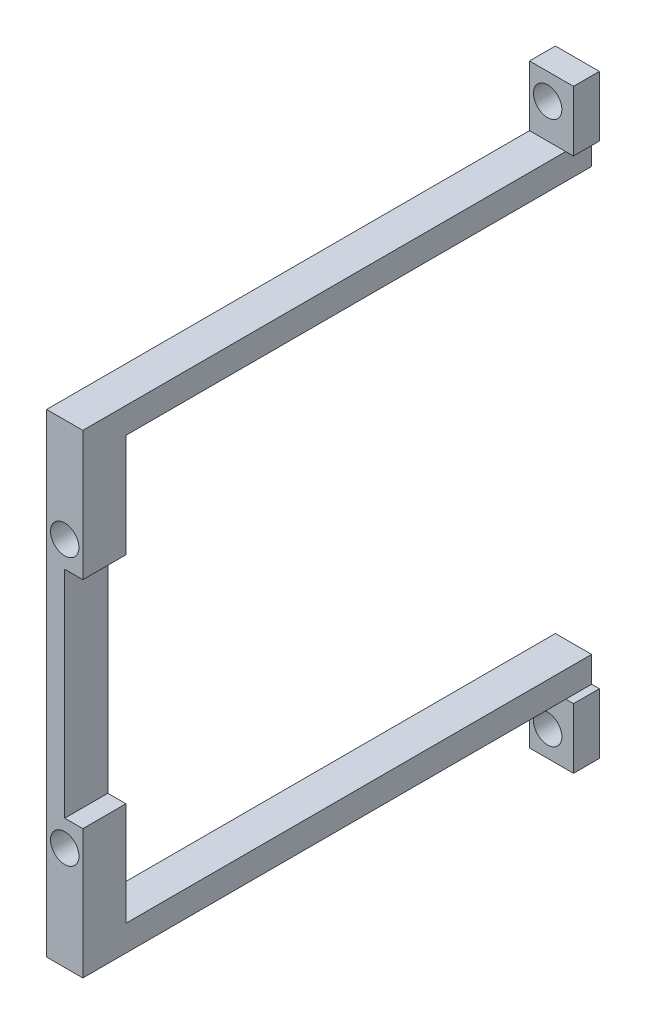
ISO-10303-21;
HEADER;
FILE_DESCRIPTION(('STEP AP214'),'2;1');
FILE_NAME('part.step','',(''),(''),'','','');
FILE_SCHEMA(('AUTOMOTIVE_DESIGN { 1 0 10303 214 1 1 1 1 }'));
ENDSEC;
DATA;
#1=APPLICATION_CONTEXT('core data for automotive mechanical design processes');
#2=APPLICATION_PROTOCOL_DEFINITION('international standard','automotive_design',2000,#1);
#3=PRODUCT_CONTEXT('',#1,'mechanical');
#4=PRODUCT('Part','Part','',(#3));
#5=PRODUCT_RELATED_PRODUCT_CATEGORY('part','',(#4));
#6=PRODUCT_DEFINITION_FORMATION('','',#4);
#7=PRODUCT_DEFINITION_CONTEXT('part definition',#1,'design');
#8=PRODUCT_DEFINITION('design','',#6,#7);
#9=PRODUCT_DEFINITION_SHAPE('','',#8);
#10=(LENGTH_UNIT() NAMED_UNIT(*) SI_UNIT(.MILLI.,.METRE.));
#11=(NAMED_UNIT(*) PLANE_ANGLE_UNIT() SI_UNIT($,.RADIAN.));
#12=(NAMED_UNIT(*) SI_UNIT($,.STERADIAN.) SOLID_ANGLE_UNIT());
#13=UNCERTAINTY_MEASURE_WITH_UNIT(LENGTH_MEASURE(1.E-05),#10,'distance_accuracy_value','');
#14=(GEOMETRIC_REPRESENTATION_CONTEXT(3) GLOBAL_UNCERTAINTY_ASSIGNED_CONTEXT((#13)) GLOBAL_UNIT_ASSIGNED_CONTEXT((#10,
#11,#12)) REPRESENTATION_CONTEXT('',''));
#15=CARTESIAN_POINT('',(0.,0.,0.));
#16=DIRECTION('',(0.,0.,1.));
#17=DIRECTION('',(1.,0.,0.));
#18=AXIS2_PLACEMENT_3D('',#15,#16,#17);
#19=CARTESIAN_POINT('',(4.2,-49.,5.));
#20=DIRECTION('',(-1.,0.,0.));
#21=DIRECTION('',(0.,0.,1.));
#22=AXIS2_PLACEMENT_3D('',#19,#20,#21);
#23=PLANE('',#22);
#24=DIRECTION('',(0.,1.,0.));
#25=VECTOR('',#24,1.);
#26=CARTESIAN_POINT('',(4.2,-49.,5.));
#27=LINE('',#26,#25);
#28=CARTESIAN_POINT('',(4.2,-12.,5.));
#29=VERTEX_POINT('',#28);
#30=CARTESIAN_POINT('',(4.2,3.,5.));
#31=VERTEX_POINT('',#30);
#32=EDGE_CURVE('E385',#29,#31,#27,.T.);
#33=ORIENTED_EDGE('',*,*,#32,.F.);
#34=DIRECTION('',(0.,0.,-1.));
#35=VECTOR('',#34,1.);
#36=CARTESIAN_POINT('',(4.2,-12.,5.));
#37=LINE('',#36,#35);
#38=CARTESIAN_POINT('',(4.2,-12.,0.));
#39=VERTEX_POINT('',#38);
#40=EDGE_CURVE('E179',#29,#39,#37,.T.);
#41=ORIENTED_EDGE('',*,*,#40,.T.);
#42=DIRECTION('',(0.,1.,0.));
#43=VECTOR('',#42,1.);
#44=CARTESIAN_POINT('',(4.2,-49.,0.));
#45=LINE('',#44,#43);
#46=CARTESIAN_POINT('',(4.2,0.,0.));
#47=VERTEX_POINT('',#46);
#48=EDGE_CURVE('E400',#39,#47,#45,.T.);
#49=ORIENTED_EDGE('',*,*,#48,.T.);
#50=DIRECTION('',(0.,0.,1.));
#51=VECTOR('',#50,1.);
#52=CARTESIAN_POINT('',(4.2,0.,-54.));
#53=LINE('',#52,#51);
#54=CARTESIAN_POINT('',(4.2,0.,-54.));
#55=VERTEX_POINT('',#54);
#56=EDGE_CURVE('E311',#55,#47,#53,.T.);
#57=ORIENTED_EDGE('',*,*,#56,.F.);
#58=DIRECTION('',(0.,1.,0.));
#59=VECTOR('',#58,1.);
#60=CARTESIAN_POINT('',(4.2,3.,-54.));
#61=LINE('',#60,#59);
#62=CARTESIAN_POINT('',(4.2,3.,-54.));
#63=VERTEX_POINT('',#62);
#64=EDGE_CURVE('E306',#55,#63,#61,.T.);
#65=ORIENTED_EDGE('',*,*,#64,.T.);
#66=DIRECTION('',(0.,0.,1.));
#67=VECTOR('',#66,1.);
#68=CARTESIAN_POINT('',(4.2,3.,-54.));
#69=LINE('',#68,#67);
#70=CARTESIAN_POINT('',(4.2,3.,-51.));
#71=VERTEX_POINT('',#70);
#72=EDGE_CURVE('E315',#63,#71,#69,.T.);
#73=ORIENTED_EDGE('',*,*,#72,.T.);
#74=EDGE_CURVE('E296',#71,#31,#69,.T.);
#75=ORIENTED_EDGE('',*,*,#74,.T.);
#76=EDGE_LOOP('',(#33,#41,#49,#57,#65,#73,#75));
#77=FACE_BOUND('',#76,.T.);
#78=ADVANCED_FACE('F42',(#77),#23,.F.);
#79=CARTESIAN_POINT('',(0.,-52.,-54.));
#80=DIRECTION('',(0.,-1.,0.));
#81=DIRECTION('',(0.,0.,-1.));
#82=AXIS2_PLACEMENT_3D('',#79,#80,#81);
#83=PLANE('',#82);
#84=DIRECTION('',(0.,0.,1.));
#85=VECTOR('',#84,1.);
#86=CARTESIAN_POINT('',(0.,-52.,-54.));
#87=LINE('',#86,#85);
#88=CARTESIAN_POINT('',(0.,-52.,-51.));
#89=VERTEX_POINT('',#88);
#90=CARTESIAN_POINT('',(0.,-52.,5.));
#91=VERTEX_POINT('',#90);
#92=EDGE_CURVE('E359',#89,#91,#87,.T.);
#93=ORIENTED_EDGE('',*,*,#92,.F.);
#94=DIRECTION('',(1.,0.,0.));
#95=VECTOR('',#94,1.);
#96=CARTESIAN_POINT('',(2.1,-52.,-51.));
#97=LINE('',#96,#95);
#98=CARTESIAN_POINT('',(4.2,-52.,-51.));
#99=VERTEX_POINT('',#98);
#100=EDGE_CURVE('E241',#89,#99,#97,.T.);
#101=ORIENTED_EDGE('',*,*,#100,.T.);
#102=DIRECTION('',(0.,0.,1.));
#103=VECTOR('',#102,1.);
#104=CARTESIAN_POINT('',(4.2,-52.,-54.));
#105=LINE('',#104,#103);
#106=CARTESIAN_POINT('',(4.2,-52.,5.));
#107=VERTEX_POINT('',#106);
#108=EDGE_CURVE('E358',#99,#107,#105,.T.);
#109=ORIENTED_EDGE('',*,*,#108,.T.);
#110=DIRECTION('',(1.,0.,0.));
#111=VECTOR('',#110,1.);
#112=CARTESIAN_POINT('',(0.,-52.,5.));
#113=LINE('',#112,#111);
#114=EDGE_CURVE('E323',#91,#107,#113,.T.);
#115=ORIENTED_EDGE('',*,*,#114,.F.);
#116=EDGE_LOOP('',(#93,#101,#109,#115));
#117=FACE_BOUND('',#116,.T.);
#118=ADVANCED_FACE('F436',(#117),#83,.T.);
#119=CARTESIAN_POINT('',(0.,3.,-54.));
#120=DIRECTION('',(0.,1.,0.));
#121=DIRECTION('',(0.,0.,1.));
#122=AXIS2_PLACEMENT_3D('',#119,#120,#121);
#123=PLANE('',#122);
#124=ORIENTED_EDGE('',*,*,#74,.F.);
#125=DIRECTION('',(-1.,0.,0.));
#126=VECTOR('',#125,1.);
#127=CARTESIAN_POINT('',(2.1,3.,-51.));
#128=LINE('',#127,#126);
#129=CARTESIAN_POINT('',(0.,3.,-51.));
#130=VERTEX_POINT('',#129);
#131=EDGE_CURVE('E270',#71,#130,#128,.T.);
#132=ORIENTED_EDGE('',*,*,#131,.T.);
#133=DIRECTION('',(0.,0.,1.));
#134=VECTOR('',#133,1.);
#135=CARTESIAN_POINT('',(0.,3.,-54.));
#136=LINE('',#135,#134);
#137=CARTESIAN_POINT('',(0.,3.,5.));
#138=VERTEX_POINT('',#137);
#139=EDGE_CURVE('E303',#130,#138,#136,.T.);
#140=ORIENTED_EDGE('',*,*,#139,.T.);
#141=DIRECTION('',(-1.,0.,0.));
#142=VECTOR('',#141,1.);
#143=CARTESIAN_POINT('',(0.,3.,5.));
#144=LINE('',#143,#142);
#145=EDGE_CURVE('E319',#31,#138,#144,.T.);
#146=ORIENTED_EDGE('',*,*,#145,.F.);
#147=EDGE_LOOP('',(#124,#132,#140,#146));
#148=FACE_BOUND('',#147,.T.);
#149=ADVANCED_FACE('F443',(#148),#123,.T.);
#150=CARTESIAN_POINT('',(0.,0.,5.));
#151=DIRECTION('',(1.,0.,0.));
#152=DIRECTION('',(0.,0.,-1.));
#153=AXIS2_PLACEMENT_3D('',#150,#151,#152);
#154=PLANE('',#153);
#155=DIRECTION('',(0.,-1.,0.));
#156=VECTOR('',#155,1.);
#157=CARTESIAN_POINT('',(0.,0.,0.));
#158=LINE('',#157,#156);
#159=CARTESIAN_POINT('',(0.,0.,0.));
#160=VERTEX_POINT('',#159);
#161=CARTESIAN_POINT('',(0.,-49.,0.));
#162=VERTEX_POINT('',#161);
#163=EDGE_CURVE('E393',#160,#162,#158,.T.);
#164=ORIENTED_EDGE('',*,*,#163,.T.);
#165=DIRECTION('',(0.,0.,1.));
#166=VECTOR('',#165,1.);
#167=CARTESIAN_POINT('',(0.,-49.,-54.));
#168=LINE('',#167,#166);
#169=CARTESIAN_POINT('',(0.,-49.,-54.));
#170=VERTEX_POINT('',#169);
#171=EDGE_CURVE('E346',#170,#162,#168,.T.);
#172=ORIENTED_EDGE('',*,*,#171,.F.);
#173=DIRECTION('',(0.,-1.,0.));
#174=VECTOR('',#173,1.);
#175=CARTESIAN_POINT('',(0.,-49.,-54.));
#176=LINE('',#175,#174);
#177=CARTESIAN_POINT('',(0.,-59.,-54.));
#178=VERTEX_POINT('',#177);
#179=EDGE_CURVE('E339',#170,#178,#176,.T.);
#180=ORIENTED_EDGE('',*,*,#179,.T.);
#181=DIRECTION('',(0.,0.,-1.));
#182=VECTOR('',#181,1.);
#183=CARTESIAN_POINT('',(0.,-59.,-51.));
#184=LINE('',#183,#182);
#185=CARTESIAN_POINT('',(0.,-59.,-51.));
#186=VERTEX_POINT('',#185);
#187=EDGE_CURVE('E209',#186,#178,#184,.T.);
#188=ORIENTED_EDGE('',*,*,#187,.F.);
#189=DIRECTION('',(0.,1.,0.));
#190=VECTOR('',#189,1.);
#191=CARTESIAN_POINT('',(0.,-52.,-51.));
#192=LINE('',#191,#190);
#193=EDGE_CURVE('E226',#186,#89,#192,.T.);
#194=ORIENTED_EDGE('',*,*,#193,.T.);
#195=ORIENTED_EDGE('',*,*,#92,.T.);
#196=DIRECTION('',(0.,-1.,0.));
#197=VECTOR('',#196,1.);
#198=CARTESIAN_POINT('',(0.,0.,5.));
#199=LINE('',#198,#197);
#200=EDGE_CURVE('E381',#138,#91,#199,.T.);
#201=ORIENTED_EDGE('',*,*,#200,.F.);
#202=ORIENTED_EDGE('',*,*,#139,.F.);
#203=DIRECTION('',(0.,1.,0.));
#204=VECTOR('',#203,1.);
#205=CARTESIAN_POINT('',(0.,3.,-51.));
#206=LINE('',#205,#204);
#207=CARTESIAN_POINT('',(0.,10.,-51.));
#208=VERTEX_POINT('',#207);
#209=EDGE_CURVE('E268',#130,#208,#206,.T.);
#210=ORIENTED_EDGE('',*,*,#209,.T.);
#211=DIRECTION('',(0.,0.,-1.));
#212=VECTOR('',#211,1.);
#213=CARTESIAN_POINT('',(0.,10.,-51.));
#214=LINE('',#213,#212);
#215=CARTESIAN_POINT('',(0.,10.,-54.));
#216=VERTEX_POINT('',#215);
#217=EDGE_CURVE('E282',#208,#216,#214,.T.);
#218=ORIENTED_EDGE('',*,*,#217,.T.);
#219=DIRECTION('',(0.,-1.,0.));
#220=VECTOR('',#219,1.);
#221=CARTESIAN_POINT('',(0.,0.,-54.));
#222=LINE('',#221,#220);
#223=CARTESIAN_POINT('',(0.,0.,-54.));
#224=VERTEX_POINT('',#223);
#225=EDGE_CURVE('E324',#216,#224,#222,.T.);
#226=ORIENTED_EDGE('',*,*,#225,.T.);
#227=DIRECTION('',(0.,0.,1.));
#228=VECTOR('',#227,1.);
#229=CARTESIAN_POINT('',(0.,0.,-54.));
#230=LINE('',#229,#228);
#231=EDGE_CURVE('E307',#224,#160,#230,.T.);
#232=ORIENTED_EDGE('',*,*,#231,.T.);
#233=EDGE_LOOP('',(#164,#172,#180,#188,#194,#195,#201,#202,#210,#218,#226,#232));
#234=FACE_BOUND('',#233,.T.);
#235=ADVANCED_FACE('F44',(#234),#154,.F.);
#236=CARTESIAN_POINT('',(4.2,-49.,0.));
#237=VERTEX_POINT('',#236);
#238=CARTESIAN_POINT('',(4.2,-37.,0.));
#239=VERTEX_POINT('',#238);
#240=EDGE_CURVE('E386',#237,#239,#45,.T.);
#241=ORIENTED_EDGE('',*,*,#240,.T.);
#242=DIRECTION('',(0.,0.,1.));
#243=VECTOR('',#242,1.);
#244=CARTESIAN_POINT('',(4.2,-37.,5.));
#245=LINE('',#244,#243);
#246=CARTESIAN_POINT('',(4.2,-37.,5.));
#247=VERTEX_POINT('',#246);
#248=EDGE_CURVE('E202',#239,#247,#245,.T.);
#249=ORIENTED_EDGE('',*,*,#248,.T.);
#250=EDGE_CURVE('E387',#107,#247,#27,.T.);
#251=ORIENTED_EDGE('',*,*,#250,.F.);
#252=ORIENTED_EDGE('',*,*,#108,.F.);
#253=CARTESIAN_POINT('',(4.2,-52.,-54.));
#254=VERTEX_POINT('',#253);
#255=EDGE_CURVE('E355',#254,#99,#105,.T.);
#256=ORIENTED_EDGE('',*,*,#255,.F.);
#257=DIRECTION('',(0.,1.,0.));
#258=VECTOR('',#257,1.);
#259=CARTESIAN_POINT('',(4.2,-52.,-54.));
#260=LINE('',#259,#258);
#261=CARTESIAN_POINT('',(4.2,-49.,-54.));
#262=VERTEX_POINT('',#261);
#263=EDGE_CURVE('E342',#254,#262,#260,.T.);
#264=ORIENTED_EDGE('',*,*,#263,.T.);
#265=DIRECTION('',(0.,0.,1.));
#266=VECTOR('',#265,1.);
#267=CARTESIAN_POINT('',(4.2,-49.,-54.));
#268=LINE('',#267,#266);
#269=EDGE_CURVE('E350',#262,#237,#268,.T.);
#270=ORIENTED_EDGE('',*,*,#269,.T.);
#271=EDGE_LOOP('',(#241,#249,#251,#252,#256,#264,#270));
#272=FACE_BOUND('',#271,.T.);
#273=ADVANCED_FACE('F414',(#272),#23,.F.);
#274=CARTESIAN_POINT('',(0.,0.,5.));
#275=DIRECTION('',(0.,0.,1.));
#276=DIRECTION('',(1.,0.,0.));
#277=AXIS2_PLACEMENT_3D('',#274,#275,#276);
#278=PLANE('',#277);
#279=DIRECTION('',(-1.,0.,0.));
#280=VECTOR('',#279,1.);
#281=CARTESIAN_POINT('',(9.0560741078342,-12.,5.));
#282=LINE('',#281,#280);
#283=CARTESIAN_POINT('',(2.1,-12.,5.));
#284=VERTEX_POINT('',#283);
#285=EDGE_CURVE('E174',#29,#284,#282,.T.);
#286=ORIENTED_EDGE('',*,*,#285,.F.);
#287=ORIENTED_EDGE('',*,*,#32,.T.);
#288=ORIENTED_EDGE('',*,*,#145,.T.);
#289=ORIENTED_EDGE('',*,*,#200,.T.);
#290=ORIENTED_EDGE('',*,*,#114,.T.);
#291=ORIENTED_EDGE('',*,*,#250,.T.);
#292=DIRECTION('',(1.,0.,0.));
#293=VECTOR('',#292,1.);
#294=CARTESIAN_POINT('',(2.10000000000001,-37.,5.));
#295=LINE('',#294,#293);
#296=CARTESIAN_POINT('',(2.10000000000001,-37.,5.));
#297=VERTEX_POINT('',#296);
#298=EDGE_CURVE('E191',#297,#247,#295,.T.);
#299=ORIENTED_EDGE('',*,*,#298,.F.);
#300=DIRECTION('',(0.,-1.,0.));
#301=VECTOR('',#300,1.);
#302=CARTESIAN_POINT('',(2.1,-12.,5.));
#303=LINE('',#302,#301);
#304=EDGE_CURVE('E184',#284,#297,#303,.T.);
#305=ORIENTED_EDGE('',*,*,#304,.F.);
#306=EDGE_LOOP('',(#286,#287,#288,#289,#290,#291,#299,#305));
#307=FACE_BOUND('',#306,.T.);
#308=CARTESIAN_POINT('',(2.1,-9.,5.));
#309=DIRECTION('',(0.,0.,1.));
#310=DIRECTION('',(1.,0.,0.));
#311=AXIS2_PLACEMENT_3D('',#308,#309,#310);
#312=CIRCLE('',#311,1.65);
#313=CARTESIAN_POINT('',(3.75,-9.,5.));
#314=VERTEX_POINT('',#313);
#315=EDGE_CURVE('E370',#314,#314,#312,.T.);
#316=ORIENTED_EDGE('',*,*,#315,.F.);
#317=EDGE_LOOP('',(#316));
#318=FACE_BOUND('',#317,.T.);
#319=CARTESIAN_POINT('',(2.1,-40.,5.));
#320=DIRECTION('',(0.,0.,1.));
#321=DIRECTION('',(-1.,0.,0.));
#322=AXIS2_PLACEMENT_3D('',#319,#320,#321);
#323=CIRCLE('',#322,1.65);
#324=CARTESIAN_POINT('',(0.450000000000002,-40.,5.));
#325=VERTEX_POINT('',#324);
#326=EDGE_CURVE('E374',#325,#325,#323,.T.);
#327=ORIENTED_EDGE('',*,*,#326,.F.);
#328=EDGE_LOOP('',(#327));
#329=FACE_BOUND('',#328,.T.);
#330=ADVANCED_FACE('F193',(#307,#318,#329),#278,.T.);
#331=CARTESIAN_POINT('',(0.,0.,0.));
#332=DIRECTION('',(0.,0.,1.));
#333=DIRECTION('',(1.,0.,0.));
#334=AXIS2_PLACEMENT_3D('',#331,#332,#333);
#335=PLANE('',#334);
#336=ORIENTED_EDGE('',*,*,#48,.F.);
#337=DIRECTION('',(-1.,0.,0.));
#338=VECTOR('',#337,1.);
#339=CARTESIAN_POINT('',(0.,-12.,0.));
#340=LINE('',#339,#338);
#341=CARTESIAN_POINT('',(2.1,-12.,0.));
#342=VERTEX_POINT('',#341);
#343=EDGE_CURVE('E11',#39,#342,#340,.T.);
#344=ORIENTED_EDGE('',*,*,#343,.T.);
#345=DIRECTION('',(0.,-1.,0.));
#346=VECTOR('',#345,1.);
#347=CARTESIAN_POINT('',(2.1,0.,0.));
#348=LINE('',#347,#346);
#349=CARTESIAN_POINT('',(2.10000000000001,-37.,0.));
#350=VERTEX_POINT('',#349);
#351=EDGE_CURVE('E189',#342,#350,#348,.T.);
#352=ORIENTED_EDGE('',*,*,#351,.T.);
#353=DIRECTION('',(1.,0.,0.));
#354=VECTOR('',#353,1.);
#355=CARTESIAN_POINT('',(0.,-37.,0.));
#356=LINE('',#355,#354);
#357=EDGE_CURVE('E51',#350,#239,#356,.T.);
#358=ORIENTED_EDGE('',*,*,#357,.T.);
#359=ORIENTED_EDGE('',*,*,#240,.F.);
#360=DIRECTION('',(1.,0.,0.));
#361=VECTOR('',#360,1.);
#362=CARTESIAN_POINT('',(0.,-49.,0.));
#363=LINE('',#362,#361);
#364=EDGE_CURVE('E396',#162,#237,#363,.T.);
#365=ORIENTED_EDGE('',*,*,#364,.F.);
#366=ORIENTED_EDGE('',*,*,#163,.F.);
#367=DIRECTION('',(-1.,0.,0.));
#368=VECTOR('',#367,1.);
#369=CARTESIAN_POINT('',(4.2,0.,0.));
#370=LINE('',#369,#368);
#371=EDGE_CURVE('E369',#47,#160,#370,.T.);
#372=ORIENTED_EDGE('',*,*,#371,.F.);
#373=EDGE_LOOP('',(#336,#344,#352,#358,#359,#365,#366,#372));
#374=FACE_BOUND('',#373,.T.);
#375=CARTESIAN_POINT('',(2.1,-9.,0.));
#376=DIRECTION('',(0.,0.,1.));
#377=DIRECTION('',(1.,0.,0.));
#378=AXIS2_PLACEMENT_3D('',#375,#376,#377);
#379=CIRCLE('',#378,1.65);
#380=CARTESIAN_POINT('',(3.75,-9.,0.));
#381=VERTEX_POINT('',#380);
#382=EDGE_CURVE('E365',#381,#381,#379,.T.);
#383=ORIENTED_EDGE('',*,*,#382,.T.);
#384=EDGE_LOOP('',(#383));
#385=FACE_BOUND('',#384,.T.);
#386=CARTESIAN_POINT('',(2.1,-40.,0.));
#387=DIRECTION('',(0.,0.,1.));
#388=DIRECTION('',(-1.,0.,0.));
#389=AXIS2_PLACEMENT_3D('',#386,#387,#388);
#390=CIRCLE('',#389,1.65);
#391=CARTESIAN_POINT('',(0.450000000000002,-40.,0.));
#392=VERTEX_POINT('',#391);
#393=EDGE_CURVE('E354',#392,#392,#390,.T.);
#394=ORIENTED_EDGE('',*,*,#393,.T.);
#395=EDGE_LOOP('',(#394));
#396=FACE_BOUND('',#395,.T.);
#397=ADVANCED_FACE('F409',(#374,#385,#396),#335,.F.);
#398=CARTESIAN_POINT('',(2.1,-40.,0.));
#399=DIRECTION('',(0.,0.,1.));
#400=DIRECTION('',(1.,0.,0.));
#401=AXIS2_PLACEMENT_3D('',#398,#399,#400);
#402=CYLINDRICAL_SURFACE('',#401,1.65);
#403=ORIENTED_EDGE('',*,*,#393,.F.);
#404=EDGE_LOOP('',(#403));
#405=FACE_BOUND('',#404,.T.);
#406=ORIENTED_EDGE('',*,*,#326,.T.);
#407=EDGE_LOOP('',(#406));
#408=FACE_BOUND('',#407,.T.);
#409=ADVANCED_FACE('F507',(#405,#408),#402,.F.);
#410=CARTESIAN_POINT('',(2.1,-9.,0.));
#411=DIRECTION('',(0.,0.,1.));
#412=DIRECTION('',(1.,0.,0.));
#413=AXIS2_PLACEMENT_3D('',#410,#411,#412);
#414=CYLINDRICAL_SURFACE('',#413,1.65);
#415=ORIENTED_EDGE('',*,*,#382,.F.);
#416=EDGE_LOOP('',(#415));
#417=FACE_BOUND('',#416,.T.);
#418=ORIENTED_EDGE('',*,*,#315,.T.);
#419=EDGE_LOOP('',(#418));
#420=FACE_BOUND('',#419,.T.);
#421=ADVANCED_FACE('F504',(#417,#420),#414,.F.);
#422=CARTESIAN_POINT('',(4.2,-49.,-54.));
#423=DIRECTION('',(0.,1.,0.));
#424=DIRECTION('',(0.,0.,1.));
#425=AXIS2_PLACEMENT_3D('',#422,#423,#424);
#426=PLANE('',#425);
#427=ORIENTED_EDGE('',*,*,#171,.T.);
#428=ORIENTED_EDGE('',*,*,#364,.T.);
#429=ORIENTED_EDGE('',*,*,#269,.F.);
#430=DIRECTION('',(-1.,0.,0.));
#431=VECTOR('',#430,1.);
#432=CARTESIAN_POINT('',(4.2,-49.,-54.));
#433=LINE('',#432,#431);
#434=EDGE_CURVE('E335',#262,#170,#433,.T.);
#435=ORIENTED_EDGE('',*,*,#434,.T.);
#436=EDGE_LOOP('',(#427,#428,#429,#435));
#437=FACE_BOUND('',#436,.T.);
#438=ADVANCED_FACE('F420',(#437),#426,.T.);
#439=CARTESIAN_POINT('',(0.,0.,-54.));
#440=DIRECTION('',(0.,0.,1.));
#441=DIRECTION('',(1.,0.,0.));
#442=AXIS2_PLACEMENT_3D('',#439,#440,#441);
#443=PLANE('',#442);
#444=ORIENTED_EDGE('',*,*,#434,.F.);
#445=ORIENTED_EDGE('',*,*,#263,.F.);
#446=DIRECTION('',(1.,0.,0.));
#447=VECTOR('',#446,1.);
#448=CARTESIAN_POINT('',(2.1,-52.,-54.));
#449=LINE('',#448,#447);
#450=CARTESIAN_POINT('',(5.1,-52.,-54.));
#451=VERTEX_POINT('',#450);
#452=EDGE_CURVE('E230',#254,#451,#449,.T.);
#453=ORIENTED_EDGE('',*,*,#452,.T.);
#454=DIRECTION('',(0.,-1.,0.));
#455=VECTOR('',#454,1.);
#456=CARTESIAN_POINT('',(5.1,-59.,-54.));
#457=LINE('',#456,#455);
#458=CARTESIAN_POINT('',(5.1,-59.,-54.));
#459=VERTEX_POINT('',#458);
#460=EDGE_CURVE('E225',#451,#459,#457,.T.);
#461=ORIENTED_EDGE('',*,*,#460,.T.);
#462=DIRECTION('',(-1.,0.,0.));
#463=VECTOR('',#462,1.);
#464=CARTESIAN_POINT('',(0.,-59.,-54.));
#465=LINE('',#464,#463);
#466=EDGE_CURVE('E221',#459,#178,#465,.T.);
#467=ORIENTED_EDGE('',*,*,#466,.T.);
#468=ORIENTED_EDGE('',*,*,#179,.F.);
#469=EDGE_LOOP('',(#444,#445,#453,#461,#467,#468));
#470=FACE_BOUND('',#469,.T.);
#471=CARTESIAN_POINT('',(2.1,-56.,-54.));
#472=DIRECTION('',(0.,0.,-1.));
#473=DIRECTION('',(1.,0.,0.));
#474=AXIS2_PLACEMENT_3D('',#471,#472,#473);
#475=CIRCLE('',#474,1.65);
#476=CARTESIAN_POINT('',(3.75,-56.,-54.));
#477=VERTEX_POINT('',#476);
#478=EDGE_CURVE('E248',#477,#477,#475,.T.);
#479=ORIENTED_EDGE('',*,*,#478,.F.);
#480=EDGE_LOOP('',(#479));
#481=FACE_BOUND('',#480,.T.);
#482=ADVANCED_FACE('F423',(#470,#481),#443,.F.);
#483=CARTESIAN_POINT('',(4.2,0.,-54.));
#484=DIRECTION('',(0.,-1.,0.));
#485=DIRECTION('',(0.,0.,-1.));
#486=AXIS2_PLACEMENT_3D('',#483,#484,#485);
#487=PLANE('',#486);
#488=ORIENTED_EDGE('',*,*,#56,.T.);
#489=ORIENTED_EDGE('',*,*,#371,.T.);
#490=ORIENTED_EDGE('',*,*,#231,.F.);
#491=DIRECTION('',(1.,0.,0.));
#492=VECTOR('',#491,1.);
#493=CARTESIAN_POINT('',(4.2,0.,-54.));
#494=LINE('',#493,#492);
#495=EDGE_CURVE('E328',#224,#55,#494,.T.);
#496=ORIENTED_EDGE('',*,*,#495,.T.);
#497=EDGE_LOOP('',(#488,#489,#490,#496));
#498=FACE_BOUND('',#497,.T.);
#499=ADVANCED_FACE('F491',(#498),#487,.T.);
#500=CARTESIAN_POINT('',(0.,0.,-54.));
#501=DIRECTION('',(0.,0.,-1.));
#502=DIRECTION('',(-1.,0.,0.));
#503=AXIS2_PLACEMENT_3D('',#500,#501,#502);
#504=PLANE('',#503);
#505=ORIENTED_EDGE('',*,*,#225,.F.);
#506=DIRECTION('',(1.,0.,0.));
#507=VECTOR('',#506,1.);
#508=CARTESIAN_POINT('',(0.,10.,-54.));
#509=LINE('',#508,#507);
#510=CARTESIAN_POINT('',(5.1,10.,-54.));
#511=VERTEX_POINT('',#510);
#512=EDGE_CURVE('E260',#216,#511,#509,.T.);
#513=ORIENTED_EDGE('',*,*,#512,.T.);
#514=DIRECTION('',(0.,-1.,0.));
#515=VECTOR('',#514,1.);
#516=CARTESIAN_POINT('',(5.1,10.,-54.));
#517=LINE('',#516,#515);
#518=CARTESIAN_POINT('',(5.1,3.,-54.));
#519=VERTEX_POINT('',#518);
#520=EDGE_CURVE('E286',#511,#519,#517,.T.);
#521=ORIENTED_EDGE('',*,*,#520,.T.);
#522=DIRECTION('',(-1.,0.,0.));
#523=VECTOR('',#522,1.);
#524=CARTESIAN_POINT('',(2.1,3.,-54.));
#525=LINE('',#524,#523);
#526=EDGE_CURVE('E269',#519,#63,#525,.T.);
#527=ORIENTED_EDGE('',*,*,#526,.T.);
#528=ORIENTED_EDGE('',*,*,#64,.F.);
#529=ORIENTED_EDGE('',*,*,#495,.F.);
#530=EDGE_LOOP('',(#505,#513,#521,#527,#528,#529));
#531=FACE_BOUND('',#530,.T.);
#532=CARTESIAN_POINT('',(2.1,7.,-54.));
#533=DIRECTION('',(0.,0.,-1.));
#534=DIRECTION('',(-1.,0.,0.));
#535=AXIS2_PLACEMENT_3D('',#532,#533,#534);
#536=CIRCLE('',#535,1.65);
#537=CARTESIAN_POINT('',(0.45,7.,-54.));
#538=VERTEX_POINT('',#537);
#539=EDGE_CURVE('E252',#538,#538,#536,.T.);
#540=ORIENTED_EDGE('',*,*,#539,.F.);
#541=EDGE_LOOP('',(#540));
#542=FACE_BOUND('',#541,.T.);
#543=ADVANCED_FACE('F494',(#531,#542),#504,.T.);
#544=CARTESIAN_POINT('',(2.1,3.,-51.));
#545=DIRECTION('',(0.,-1.,0.));
#546=DIRECTION('',(1.,0.,0.));
#547=AXIS2_PLACEMENT_3D('',#544,#545,#546);
#548=PLANE('',#547);
#549=ORIENTED_EDGE('',*,*,#72,.F.);
#550=ORIENTED_EDGE('',*,*,#526,.F.);
#551=DIRECTION('',(0.,0.,-1.));
#552=VECTOR('',#551,1.);
#553=CARTESIAN_POINT('',(5.1,3.,-51.));
#554=LINE('',#553,#552);
#555=CARTESIAN_POINT('',(5.1,3.,-51.));
#556=VERTEX_POINT('',#555);
#557=EDGE_CURVE('E293',#556,#519,#554,.T.);
#558=ORIENTED_EDGE('',*,*,#557,.F.);
#559=EDGE_CURVE('E264',#556,#71,#128,.T.);
#560=ORIENTED_EDGE('',*,*,#559,.T.);
#561=EDGE_LOOP('',(#549,#550,#558,#560));
#562=FACE_BOUND('',#561,.T.);
#563=ADVANCED_FACE('F498',(#562),#548,.T.);
#564=CARTESIAN_POINT('',(5.1,10.,-51.));
#565=DIRECTION('',(1.,0.,0.));
#566=DIRECTION('',(0.,0.,-1.));
#567=AXIS2_PLACEMENT_3D('',#564,#565,#566);
#568=PLANE('',#567);
#569=ORIENTED_EDGE('',*,*,#520,.F.);
#570=DIRECTION('',(0.,0.,-1.));
#571=VECTOR('',#570,1.);
#572=CARTESIAN_POINT('',(5.1,10.,-51.));
#573=LINE('',#572,#571);
#574=CARTESIAN_POINT('',(5.1,10.,-51.));
#575=VERTEX_POINT('',#574);
#576=EDGE_CURVE('E297',#575,#511,#573,.T.);
#577=ORIENTED_EDGE('',*,*,#576,.F.);
#578=DIRECTION('',(0.,-1.,0.));
#579=VECTOR('',#578,1.);
#580=CARTESIAN_POINT('',(5.1,10.,-51.));
#581=LINE('',#580,#579);
#582=EDGE_CURVE('E278',#575,#556,#581,.T.);
#583=ORIENTED_EDGE('',*,*,#582,.T.);
#584=ORIENTED_EDGE('',*,*,#557,.T.);
#585=EDGE_LOOP('',(#569,#577,#583,#584));
#586=FACE_BOUND('',#585,.T.);
#587=ADVANCED_FACE('F615',(#586),#568,.T.);
#588=CARTESIAN_POINT('',(0.,10.,-51.));
#589=DIRECTION('',(0.,1.,0.));
#590=DIRECTION('',(0.,0.,1.));
#591=AXIS2_PLACEMENT_3D('',#588,#589,#590);
#592=PLANE('',#591);
#593=ORIENTED_EDGE('',*,*,#512,.F.);
#594=ORIENTED_EDGE('',*,*,#217,.F.);
#595=DIRECTION('',(1.,0.,0.));
#596=VECTOR('',#595,1.);
#597=CARTESIAN_POINT('',(0.,10.,-51.));
#598=LINE('',#597,#596);
#599=EDGE_CURVE('E274',#208,#575,#598,.T.);
#600=ORIENTED_EDGE('',*,*,#599,.T.);
#601=ORIENTED_EDGE('',*,*,#576,.T.);
#602=EDGE_LOOP('',(#593,#594,#600,#601));
#603=FACE_BOUND('',#602,.T.);
#604=ADVANCED_FACE('F489',(#603),#592,.T.);
#605=CARTESIAN_POINT('',(0.,0.,-51.));
#606=DIRECTION('',(0.,0.,-1.));
#607=DIRECTION('',(-1.,0.,0.));
#608=AXIS2_PLACEMENT_3D('',#605,#606,#607);
#609=PLANE('',#608);
#610=CARTESIAN_POINT('',(2.1,7.,-51.));
#611=DIRECTION('',(0.,0.,-1.));
#612=DIRECTION('',(-1.,0.,0.));
#613=AXIS2_PLACEMENT_3D('',#610,#611,#612);
#614=CIRCLE('',#613,1.65);
#615=CARTESIAN_POINT('',(0.45,7.,-51.));
#616=VERTEX_POINT('',#615);
#617=EDGE_CURVE('E256',#616,#616,#614,.T.);
#618=ORIENTED_EDGE('',*,*,#617,.T.);
#619=EDGE_LOOP('',(#618));
#620=FACE_BOUND('',#619,.T.);
#621=ORIENTED_EDGE('',*,*,#559,.F.);
#622=ORIENTED_EDGE('',*,*,#582,.F.);
#623=ORIENTED_EDGE('',*,*,#599,.F.);
#624=ORIENTED_EDGE('',*,*,#209,.F.);
#625=ORIENTED_EDGE('',*,*,#131,.F.);
#626=EDGE_LOOP('',(#621,#622,#623,#624,#625));
#627=FACE_BOUND('',#626,.T.);
#628=ADVANCED_FACE('F596',(#620,#627),#609,.F.);
#629=CARTESIAN_POINT('',(2.1,7.,-51.));
#630=DIRECTION('',(0.,0.,-1.));
#631=DIRECTION('',(-1.,0.,0.));
#632=AXIS2_PLACEMENT_3D('',#629,#630,#631);
#633=CYLINDRICAL_SURFACE('',#632,1.65);
#634=ORIENTED_EDGE('',*,*,#617,.F.);
#635=EDGE_LOOP('',(#634));
#636=FACE_BOUND('',#635,.T.);
#637=ORIENTED_EDGE('',*,*,#539,.T.);
#638=EDGE_LOOP('',(#637));
#639=FACE_BOUND('',#638,.T.);
#640=ADVANCED_FACE('F465',(#636,#639),#633,.F.);
#641=CARTESIAN_POINT('',(0.,-59.,-51.));
#642=DIRECTION('',(0.,-1.,0.));
#643=DIRECTION('',(0.,0.,-1.));
#644=AXIS2_PLACEMENT_3D('',#641,#642,#643);
#645=PLANE('',#644);
#646=ORIENTED_EDGE('',*,*,#466,.F.);
#647=DIRECTION('',(0.,0.,-1.));
#648=VECTOR('',#647,1.);
#649=CARTESIAN_POINT('',(5.1,-59.,-51.));
#650=LINE('',#649,#648);
#651=CARTESIAN_POINT('',(5.1,-59.,-51.));
#652=VERTEX_POINT('',#651);
#653=EDGE_CURVE('E215',#652,#459,#650,.T.);
#654=ORIENTED_EDGE('',*,*,#653,.F.);
#655=DIRECTION('',(-1.,0.,0.));
#656=VECTOR('',#655,1.);
#657=CARTESIAN_POINT('',(0.,-59.,-51.));
#658=LINE('',#657,#656);
#659=EDGE_CURVE('E214',#652,#186,#658,.T.);
#660=ORIENTED_EDGE('',*,*,#659,.T.);
#661=ORIENTED_EDGE('',*,*,#187,.T.);
#662=EDGE_LOOP('',(#646,#654,#660,#661));
#663=FACE_BOUND('',#662,.T.);
#664=ADVANCED_FACE('F429',(#663),#645,.T.);
#665=CARTESIAN_POINT('',(5.1,-59.,-51.));
#666=DIRECTION('',(1.,0.,0.));
#667=DIRECTION('',(0.,0.,-1.));
#668=AXIS2_PLACEMENT_3D('',#665,#666,#667);
#669=PLANE('',#668);
#670=ORIENTED_EDGE('',*,*,#460,.F.);
#671=DIRECTION('',(0.,0.,-1.));
#672=VECTOR('',#671,1.);
#673=CARTESIAN_POINT('',(5.1,-52.,-51.));
#674=LINE('',#673,#672);
#675=CARTESIAN_POINT('',(5.1,-52.,-51.));
#676=VERTEX_POINT('',#675);
#677=EDGE_CURVE('E210',#676,#451,#674,.T.);
#678=ORIENTED_EDGE('',*,*,#677,.F.);
#679=DIRECTION('',(0.,-1.,0.));
#680=VECTOR('',#679,1.);
#681=CARTESIAN_POINT('',(5.1,-59.,-51.));
#682=LINE('',#681,#680);
#683=EDGE_CURVE('E237',#676,#652,#682,.T.);
#684=ORIENTED_EDGE('',*,*,#683,.T.);
#685=ORIENTED_EDGE('',*,*,#653,.T.);
#686=EDGE_LOOP('',(#670,#678,#684,#685));
#687=FACE_BOUND('',#686,.T.);
#688=ADVANCED_FACE('F457',(#687),#669,.T.);
#689=CARTESIAN_POINT('',(2.1,-52.,-51.));
#690=DIRECTION('',(0.,1.,0.));
#691=DIRECTION('',(0.,0.,1.));
#692=AXIS2_PLACEMENT_3D('',#689,#690,#691);
#693=PLANE('',#692);
#694=ORIENTED_EDGE('',*,*,#452,.F.);
#695=ORIENTED_EDGE('',*,*,#255,.T.);
#696=EDGE_CURVE('E66',#99,#676,#97,.T.);
#697=ORIENTED_EDGE('',*,*,#696,.T.);
#698=ORIENTED_EDGE('',*,*,#677,.T.);
#699=EDGE_LOOP('',(#694,#695,#697,#698));
#700=FACE_BOUND('',#699,.T.);
#701=ADVANCED_FACE('F454',(#700),#693,.T.);
#702=CARTESIAN_POINT('',(0.,0.,-51.));
#703=DIRECTION('',(0.,0.,1.));
#704=DIRECTION('',(1.,0.,0.));
#705=AXIS2_PLACEMENT_3D('',#702,#703,#704);
#706=PLANE('',#705);
#707=CARTESIAN_POINT('',(2.1,-56.,-51.));
#708=DIRECTION('',(0.,0.,-1.));
#709=DIRECTION('',(1.,0.,0.));
#710=AXIS2_PLACEMENT_3D('',#707,#708,#709);
#711=CIRCLE('',#710,1.65);
#712=CARTESIAN_POINT('',(3.75,-56.,-51.));
#713=VERTEX_POINT('',#712);
#714=EDGE_CURVE('E233',#713,#713,#711,.T.);
#715=ORIENTED_EDGE('',*,*,#714,.T.);
#716=EDGE_LOOP('',(#715));
#717=FACE_BOUND('',#716,.T.);
#718=ORIENTED_EDGE('',*,*,#193,.F.);
#719=ORIENTED_EDGE('',*,*,#659,.F.);
#720=ORIENTED_EDGE('',*,*,#683,.F.);
#721=ORIENTED_EDGE('',*,*,#696,.F.);
#722=ORIENTED_EDGE('',*,*,#100,.F.);
#723=EDGE_LOOP('',(#718,#719,#720,#721,#722));
#724=FACE_BOUND('',#723,.T.);
#725=ADVANCED_FACE('F431',(#717,#724),#706,.T.);
#726=CARTESIAN_POINT('',(2.1,-56.,-51.));
#727=DIRECTION('',(0.,0.,-1.));
#728=DIRECTION('',(-1.,0.,0.));
#729=AXIS2_PLACEMENT_3D('',#726,#727,#728);
#730=CYLINDRICAL_SURFACE('',#729,1.65);
#731=ORIENTED_EDGE('',*,*,#714,.F.);
#732=EDGE_LOOP('',(#731));
#733=FACE_BOUND('',#732,.T.);
#734=ORIENTED_EDGE('',*,*,#478,.T.);
#735=EDGE_LOOP('',(#734));
#736=FACE_BOUND('',#735,.T.);
#737=ADVANCED_FACE('F524',(#733,#736),#730,.F.);
#738=CARTESIAN_POINT('',(9.0560741078342,-12.,-5.));
#739=DIRECTION('',(0.,1.,0.));
#740=DIRECTION('',(-1.,0.,0.));
#741=AXIS2_PLACEMENT_3D('',#738,#739,#740);
#742=PLANE('',#741);
#743=ORIENTED_EDGE('',*,*,#285,.T.);
#744=DIRECTION('',(0.,0.,1.));
#745=VECTOR('',#744,1.);
#746=CARTESIAN_POINT('',(2.1,-12.,-5.));
#747=LINE('',#746,#745);
#748=EDGE_CURVE('E177',#342,#284,#747,.T.);
#749=ORIENTED_EDGE('',*,*,#748,.F.);
#750=ORIENTED_EDGE('',*,*,#343,.F.);
#751=ORIENTED_EDGE('',*,*,#40,.F.);
#752=EDGE_LOOP('',(#743,#749,#750,#751));
#753=FACE_BOUND('',#752,.T.);
#754=ADVANCED_FACE('F176',(#753),#742,.F.);
#755=CARTESIAN_POINT('',(2.10000000000001,-37.,-5.));
#756=DIRECTION('',(0.,-1.,0.));
#757=DIRECTION('',(0.,0.,-1.));
#758=AXIS2_PLACEMENT_3D('',#755,#756,#757);
#759=PLANE('',#758);
#760=ORIENTED_EDGE('',*,*,#357,.F.);
#761=DIRECTION('',(0.,0.,1.));
#762=VECTOR('',#761,1.);
#763=CARTESIAN_POINT('',(2.10000000000001,-37.,-5.));
#764=LINE('',#763,#762);
#765=EDGE_CURVE('E58',#350,#297,#764,.T.);
#766=ORIENTED_EDGE('',*,*,#765,.T.);
#767=ORIENTED_EDGE('',*,*,#298,.T.);
#768=ORIENTED_EDGE('',*,*,#248,.F.);
#769=EDGE_LOOP('',(#760,#766,#767,#768));
#770=FACE_BOUND('',#769,.T.);
#771=ADVANCED_FACE('F523',(#770),#759,.F.);
#772=CARTESIAN_POINT('',(2.1,-12.,-5.));
#773=DIRECTION('',(-1.,0.,0.));
#774=DIRECTION('',(0.,-1.,0.));
#775=AXIS2_PLACEMENT_3D('',#772,#773,#774);
#776=PLANE('',#775);
#777=ORIENTED_EDGE('',*,*,#748,.T.);
#778=ORIENTED_EDGE('',*,*,#304,.T.);
#779=ORIENTED_EDGE('',*,*,#765,.F.);
#780=ORIENTED_EDGE('',*,*,#351,.F.);
#781=EDGE_LOOP('',(#777,#778,#779,#780));
#782=FACE_BOUND('',#781,.T.);
#783=ADVANCED_FACE('F186',(#782),#776,.F.);
#784=CLOSED_SHELL('',(#78,#118,#149,#235,#273,#330,#397,#409,#421,#438,#482,#499,#543,#563,#587,
#604,#628,#640,#664,#688,#701,#725,#737,#754,#771,#783));
#785=MANIFOLD_SOLID_BREP('B2',#784);
#786=ADVANCED_BREP_SHAPE_REPRESENTATION('',(#18,#785),#14);
#787=SHAPE_DEFINITION_REPRESENTATION(#9,#786);
ENDSEC;
END-ISO-10303-21;
